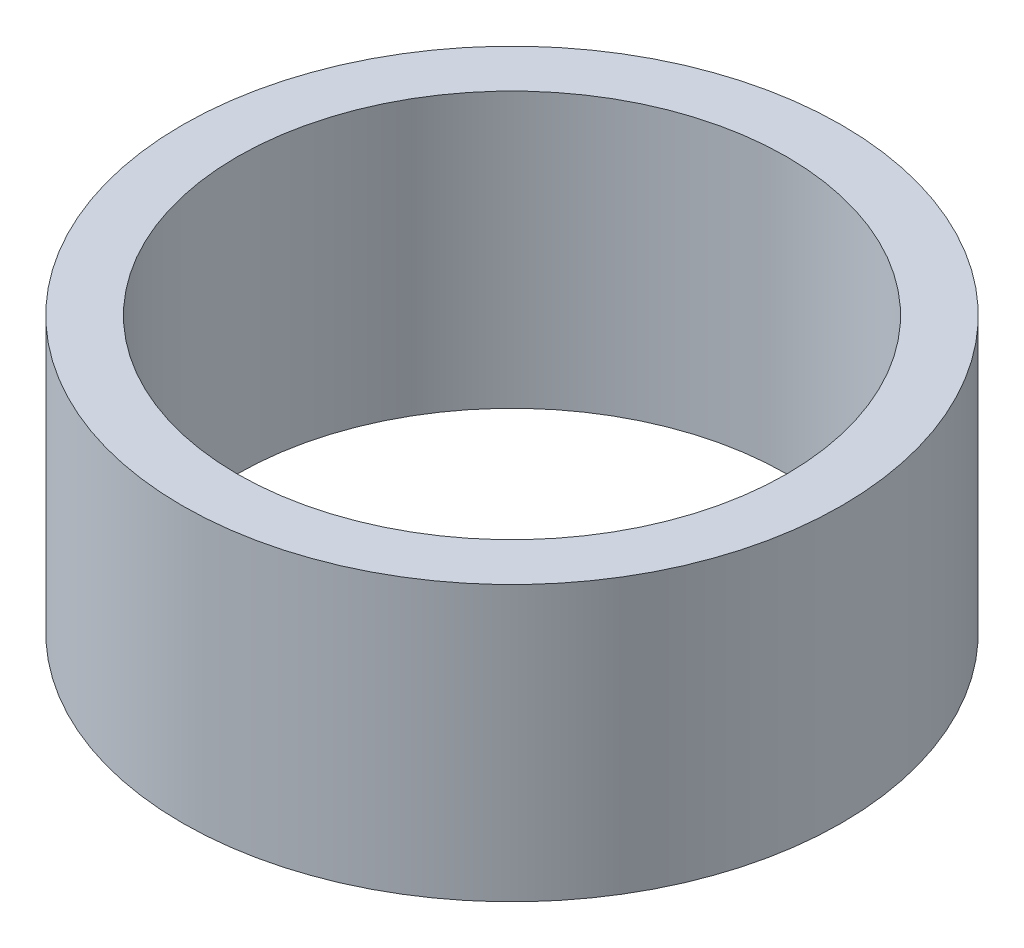
ISO-10303-21;
HEADER;
FILE_DESCRIPTION(('STEP AP214'),'2;1');
FILE_NAME('part.step','',(''),(''),'','','');
FILE_SCHEMA(('AUTOMOTIVE_DESIGN { 1 0 10303 214 1 1 1 1 }'));
ENDSEC;
DATA;
#1=APPLICATION_CONTEXT('core data for automotive mechanical design processes');
#2=APPLICATION_PROTOCOL_DEFINITION('international standard','automotive_design',2000,#1);
#3=PRODUCT_CONTEXT('',#1,'mechanical');
#4=PRODUCT('Part','Part','',(#3));
#5=PRODUCT_RELATED_PRODUCT_CATEGORY('part','',(#4));
#6=PRODUCT_DEFINITION_FORMATION('','',#4);
#7=PRODUCT_DEFINITION_CONTEXT('part definition',#1,'design');
#8=PRODUCT_DEFINITION('design','',#6,#7);
#9=PRODUCT_DEFINITION_SHAPE('','',#8);
#10=(LENGTH_UNIT() NAMED_UNIT(*) SI_UNIT(.MILLI.,.METRE.));
#11=(NAMED_UNIT(*) PLANE_ANGLE_UNIT() SI_UNIT($,.RADIAN.));
#12=(NAMED_UNIT(*) SI_UNIT($,.STERADIAN.) SOLID_ANGLE_UNIT());
#13=UNCERTAINTY_MEASURE_WITH_UNIT(LENGTH_MEASURE(1.E-05),#10,'distance_accuracy_value','');
#14=(GEOMETRIC_REPRESENTATION_CONTEXT(3) GLOBAL_UNCERTAINTY_ASSIGNED_CONTEXT((#13)) GLOBAL_UNIT_ASSIGNED_CONTEXT((#10,
#11,#12)) REPRESENTATION_CONTEXT('',''));
#15=CARTESIAN_POINT('',(0.,0.,0.));
#16=DIRECTION('',(0.,0.,1.));
#17=DIRECTION('',(1.,0.,0.));
#18=AXIS2_PLACEMENT_3D('',#15,#16,#17);
#19=CARTESIAN_POINT('',(0.,5.,0.));
#20=DIRECTION('',(0.,1.,0.));
#21=DIRECTION('',(0.,0.,1.));
#22=AXIS2_PLACEMENT_3D('',#19,#20,#21);
#23=PLANE('',#22);
#24=CARTESIAN_POINT('',(0.,5.,0.));
#25=DIRECTION('',(0.,1.,0.));
#26=DIRECTION('',(0.,0.,1.));
#27=AXIS2_PLACEMENT_3D('',#24,#25,#26);
#28=CIRCLE('',#27,6.);
#29=CARTESIAN_POINT('',(0.,5.,6.));
#30=VERTEX_POINT('',#29);
#31=EDGE_CURVE('E11',#30,#30,#28,.T.);
#32=ORIENTED_EDGE('',*,*,#31,.T.);
#33=EDGE_LOOP('',(#32));
#34=FACE_BOUND('',#33,.T.);
#35=CARTESIAN_POINT('',(0.,5.,0.));
#36=DIRECTION('',(0.,1.,0.));
#37=DIRECTION('',(0.,0.,1.));
#38=AXIS2_PLACEMENT_3D('',#35,#36,#37);
#39=CIRCLE('',#38,5.);
#40=CARTESIAN_POINT('',(0.,5.,5.));
#41=VERTEX_POINT('',#40);
#42=EDGE_CURVE('E56',#41,#41,#39,.T.);
#43=ORIENTED_EDGE('',*,*,#42,.F.);
#44=EDGE_LOOP('',(#43));
#45=FACE_BOUND('',#44,.T.);
#46=ADVANCED_FACE('F43',(#34,#45),#23,.T.);
#47=CARTESIAN_POINT('',(0.,0.,0.));
#48=DIRECTION('',(0.,1.,0.));
#49=DIRECTION('',(0.,0.,1.));
#50=AXIS2_PLACEMENT_3D('',#47,#48,#49);
#51=PLANE('',#50);
#52=CARTESIAN_POINT('',(0.,0.,0.));
#53=DIRECTION('',(0.,1.,0.));
#54=DIRECTION('',(0.,0.,1.));
#55=AXIS2_PLACEMENT_3D('',#52,#53,#54);
#56=CIRCLE('',#55,6.);
#57=CARTESIAN_POINT('',(0.,0.,6.));
#58=VERTEX_POINT('',#57);
#59=EDGE_CURVE('E47',#58,#58,#56,.T.);
#60=ORIENTED_EDGE('',*,*,#59,.F.);
#61=EDGE_LOOP('',(#60));
#62=FACE_BOUND('',#61,.T.);
#63=CARTESIAN_POINT('',(0.,0.,0.));
#64=DIRECTION('',(0.,1.,0.));
#65=DIRECTION('',(0.,0.,1.));
#66=AXIS2_PLACEMENT_3D('',#63,#64,#65);
#67=CIRCLE('',#66,5.);
#68=CARTESIAN_POINT('',(0.,0.,5.));
#69=VERTEX_POINT('',#68);
#70=EDGE_CURVE('E58',#69,#69,#67,.T.);
#71=ORIENTED_EDGE('',*,*,#70,.T.);
#72=EDGE_LOOP('',(#71));
#73=FACE_BOUND('',#72,.T.);
#74=ADVANCED_FACE('F70',(#62,#73),#51,.F.);
#75=CARTESIAN_POINT('',(0.,5.,0.));
#76=DIRECTION('',(0.,-1.,0.));
#77=DIRECTION('',(0.,0.,-1.));
#78=AXIS2_PLACEMENT_3D('',#75,#76,#77);
#79=CYLINDRICAL_SURFACE('',#78,6.);
#80=ORIENTED_EDGE('',*,*,#31,.F.);
#81=EDGE_LOOP('',(#80));
#82=FACE_BOUND('',#81,.T.);
#83=ORIENTED_EDGE('',*,*,#59,.T.);
#84=EDGE_LOOP('',(#83));
#85=FACE_BOUND('',#84,.T.);
#86=ADVANCED_FACE('F45',(#82,#85),#79,.T.);
#87=CARTESIAN_POINT('',(0.,5.,0.));
#88=DIRECTION('',(0.,-1.,0.));
#89=DIRECTION('',(0.,0.,-1.));
#90=AXIS2_PLACEMENT_3D('',#87,#88,#89);
#91=CYLINDRICAL_SURFACE('',#90,5.);
#92=ORIENTED_EDGE('',*,*,#42,.T.);
#93=EDGE_LOOP('',(#92));
#94=FACE_BOUND('',#93,.T.);
#95=ORIENTED_EDGE('',*,*,#70,.F.);
#96=EDGE_LOOP('',(#95));
#97=FACE_BOUND('',#96,.T.);
#98=ADVANCED_FACE('F66',(#94,#97),#91,.F.);
#99=CLOSED_SHELL('',(#46,#74,#86,#98));
#100=MANIFOLD_SOLID_BREP('B2',#99);
#101=ADVANCED_BREP_SHAPE_REPRESENTATION('',(#18,#100),#14);
#102=SHAPE_DEFINITION_REPRESENTATION(#9,#101);
ENDSEC;
END-ISO-10303-21;
